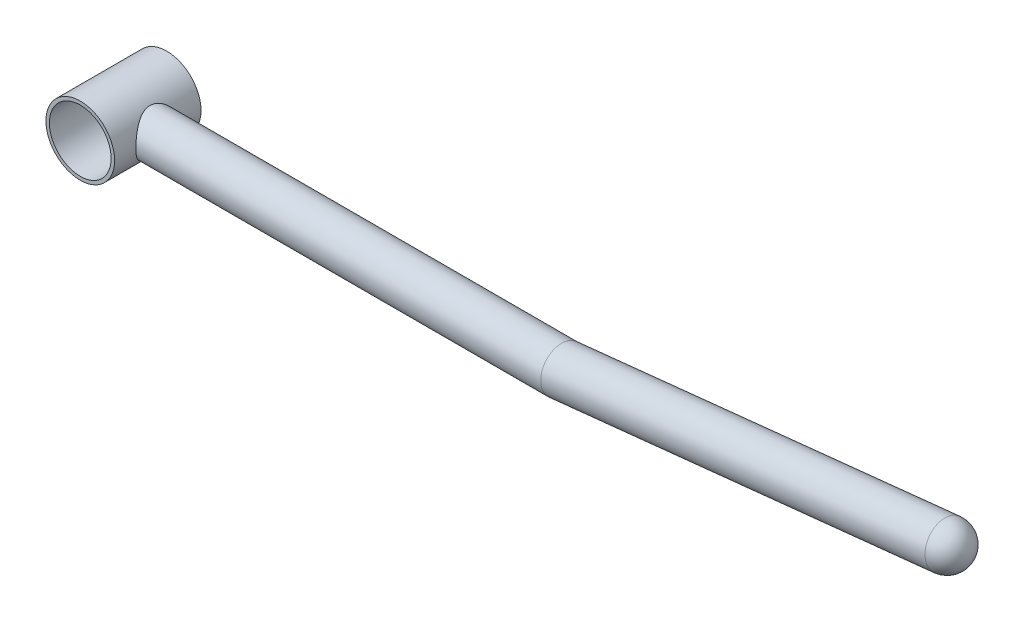
ISO-10303-21;
HEADER;
FILE_DESCRIPTION(('STEP AP214'),'2;1');
FILE_NAME('part.step','',(''),(''),'','','');
FILE_SCHEMA(('AUTOMOTIVE_DESIGN { 1 0 10303 214 1 1 1 1 }'));
ENDSEC;
DATA;
#1=APPLICATION_CONTEXT('core data for automotive mechanical design processes');
#2=APPLICATION_PROTOCOL_DEFINITION('international standard','automotive_design',2000,#1);
#3=PRODUCT_CONTEXT('',#1,'mechanical');
#4=PRODUCT('Part','Part','',(#3));
#5=PRODUCT_RELATED_PRODUCT_CATEGORY('part','',(#4));
#6=PRODUCT_DEFINITION_FORMATION('','',#4);
#7=PRODUCT_DEFINITION_CONTEXT('part definition',#1,'design');
#8=PRODUCT_DEFINITION('design','',#6,#7);
#9=PRODUCT_DEFINITION_SHAPE('','',#8);
#10=(LENGTH_UNIT() NAMED_UNIT(*) SI_UNIT(.MILLI.,.METRE.));
#11=(NAMED_UNIT(*) PLANE_ANGLE_UNIT() SI_UNIT($,.RADIAN.));
#12=(NAMED_UNIT(*) SI_UNIT($,.STERADIAN.) SOLID_ANGLE_UNIT());
#13=UNCERTAINTY_MEASURE_WITH_UNIT(LENGTH_MEASURE(1.E-05),#10,'distance_accuracy_value','');
#14=(GEOMETRIC_REPRESENTATION_CONTEXT(3) GLOBAL_UNCERTAINTY_ASSIGNED_CONTEXT((#13)) GLOBAL_UNIT_ASSIGNED_CONTEXT((#10,
#11,#12)) REPRESENTATION_CONTEXT('',''));
#15=CARTESIAN_POINT('',(0.,0.,0.));
#16=DIRECTION('',(0.,0.,1.));
#17=DIRECTION('',(1.,0.,0.));
#18=AXIS2_PLACEMENT_3D('',#15,#16,#17);
#19=CARTESIAN_POINT('',(0.,0.,-31.4999999999998));
#20=DIRECTION('',(0.,0.,1.));
#21=DIRECTION('',(1.,0.,0.));
#22=AXIS2_PLACEMENT_3D('',#19,#20,#21);
#23=CYLINDRICAL_SURFACE('',#22,22.5);
#24=CARTESIAN_POINT('',(0.,0.,-31.4999999999998));
#25=DIRECTION('',(0.,0.,1.));
#26=DIRECTION('',(1.,0.,0.));
#27=AXIS2_PLACEMENT_3D('',#24,#25,#26);
#28=CIRCLE('',#27,22.5);
#29=CARTESIAN_POINT('',(22.5,0.,-31.4999999999998));
#30=VERTEX_POINT('',#29);
#31=EDGE_CURVE('E72',#30,#30,#28,.T.);
#32=ORIENTED_EDGE('',*,*,#31,.F.);
#33=EDGE_LOOP('',(#32));
#34=FACE_BOUND('',#33,.T.);
#35=CARTESIAN_POINT('',(0.,1.11022302462516E-13,31.5));
#36=DIRECTION('',(0.,0.,1.));
#37=DIRECTION('',(1.,0.,0.));
#38=AXIS2_PLACEMENT_3D('',#35,#36,#37);
#39=CIRCLE('',#38,22.5);
#40=CARTESIAN_POINT('',(22.4999999999999,1.09773301559812E-13,31.5));
#41=VERTEX_POINT('',#40);
#42=EDGE_CURVE('E86',#41,#41,#39,.T.);
#43=ORIENTED_EDGE('',*,*,#42,.T.);
#44=EDGE_LOOP('',(#43));
#45=FACE_BOUND('',#44,.T.);
#46=ADVANCED_FACE('F67',(#34,#45),#23,.F.);
#47=CARTESIAN_POINT('',(0.,1.11022302462516E-13,31.5));
#48=DIRECTION('',(0.,0.,1.));
#49=DIRECTION('',(1.,0.,0.));
#50=AXIS2_PLACEMENT_3D('',#47,#48,#49);
#51=PLANE('',#50);
#52=CARTESIAN_POINT('',(0.,1.11022302462516E-13,31.5));
#53=DIRECTION('',(0.,0.,1.));
#54=DIRECTION('',(1.,0.,0.));
#55=AXIS2_PLACEMENT_3D('',#52,#53,#54);
#56=CIRCLE('',#55,25.);
#57=CARTESIAN_POINT('',(24.9999999999999,1.09634523681734E-13,31.5));
#58=VERTEX_POINT('',#57);
#59=EDGE_CURVE('E78',#58,#58,#56,.T.);
#60=ORIENTED_EDGE('',*,*,#59,.T.);
#61=EDGE_LOOP('',(#60));
#62=FACE_BOUND('',#61,.T.);
#63=ORIENTED_EDGE('',*,*,#42,.F.);
#64=EDGE_LOOP('',(#63));
#65=FACE_BOUND('',#64,.T.);
#66=ADVANCED_FACE('F94',(#62,#65),#51,.T.);
#67=CARTESIAN_POINT('',(0.,0.,-31.4999999999998));
#68=DIRECTION('',(0.,0.,1.));
#69=DIRECTION('',(1.,0.,0.));
#70=AXIS2_PLACEMENT_3D('',#67,#68,#69);
#71=PLANE('',#70);
#72=ORIENTED_EDGE('',*,*,#31,.T.);
#73=EDGE_LOOP('',(#72));
#74=FACE_BOUND('',#73,.T.);
#75=CARTESIAN_POINT('',(0.,0.,-31.4999999999998));
#76=DIRECTION('',(0.,0.,1.));
#77=DIRECTION('',(1.,0.,0.));
#78=AXIS2_PLACEMENT_3D('',#75,#76,#77);
#79=CIRCLE('',#78,25.);
#80=CARTESIAN_POINT('',(25.,0.,-31.4999999999998));
#81=VERTEX_POINT('',#80);
#82=EDGE_CURVE('E12',#81,#81,#79,.T.);
#83=ORIENTED_EDGE('',*,*,#82,.F.);
#84=EDGE_LOOP('',(#83));
#85=FACE_BOUND('',#84,.T.);
#86=ADVANCED_FACE('F97',(#74,#85),#71,.F.);
#87=CARTESIAN_POINT('',(0.,0.,-31.4999999999998));
#88=DIRECTION('',(0.,0.,1.));
#89=DIRECTION('',(1.,0.,0.));
#90=AXIS2_PLACEMENT_3D('',#87,#88,#89);
#91=CYLINDRICAL_SURFACE('',#90,25.);
#92=ORIENTED_EDGE('',*,*,#59,.F.);
#93=EDGE_LOOP('',(#92));
#94=FACE_BOUND('',#93,.T.);
#95=ORIENTED_EDGE('',*,*,#82,.T.);
#96=EDGE_LOOP('',(#95));
#97=FACE_BOUND('',#96,.T.);
#98=ADVANCED_FACE('F104',(#94,#97),#91,.T.);
#99=CLOSED_SHELL('',(#46,#66,#86,#98));
#100=MANIFOLD_SOLID_BREP('B2',#99);
#101=CARTESIAN_POINT('',(319.155222029483,-0.0887897425605882,0.));
#102=DIRECTION('',(0.994521895368273,0.104528463267654,0.));
#103=DIRECTION('',(-0.104528463267654,0.994521895368273,0.));
#104=AXIS2_PLACEMENT_3D('',#101,#102,#103);
#105=CYLINDRICAL_SURFACE('',#104,13.);
#106=CARTESIAN_POINT('',(320.,-2.63677968348475E-13,0.));
#107=DIRECTION('',(0.998629534754574,0.0523359562429442,0.));
#108=DIRECTION('',(0.0523359562429442,-0.998629534754574,0.));
#109=AXIS2_PLACEMENT_3D('',#106,#107,#108);
#110=ELLIPSE('',#109,13.017840497973,13.);
#111=CARTESIAN_POINT('',(320.68130113068,-13.0000000000003,0.));
#112=VERTEX_POINT('',#111);
#113=EDGE_CURVE('E66',#112,#112,#110,.T.);
#114=ORIENTED_EDGE('',*,*,#113,.F.);
#115=EDGE_LOOP('',(#114));
#116=FACE_BOUND('',#115,.T.);
#117=CARTESIAN_POINT('',(590.723717305304,28.4542092756554,0.));
#118=DIRECTION('',(0.994521895368279,0.104528463267654,0.));
#119=DIRECTION('',(-0.104528463267654,0.994521895368273,0.));
#120=AXIS2_PLACEMENT_3D('',#117,#118,#119);
#121=CIRCLE('',#120,13.);
#122=CARTESIAN_POINT('',(589.364847282825,41.382993915443,0.));
#123=VERTEX_POINT('',#122);
#124=EDGE_CURVE('E206',#123,#123,#121,.T.);
#125=ORIENTED_EDGE('',*,*,#124,.T.);
#126=EDGE_LOOP('',(#125));
#127=FACE_BOUND('',#126,.T.);
#128=ADVANCED_FACE('F146',(#116,#127),#105,.F.);
#129=CARTESIAN_POINT('',(0.,0.,-31.4999999999998));
#130=DIRECTION('',(0.,0.,1.));
#131=DIRECTION('',(1.,0.,0.));
#132=AXIS2_PLACEMENT_3D('',#129,#130,#131);
#133=CYLINDRICAL_SURFACE('',#132,25.);
#134=CARTESIAN_POINT('',(25.,0.,-16.));
#135=CARTESIAN_POINT('',(25.0000015619882,0.404925044071167,-16.0000018773157));
#136=CARTESIAN_POINT('',(24.9901420976649,0.80983241181595,-15.9846099706384));
#137=CARTESIAN_POINT('',(24.9509510419688,1.61652618236303,-15.9232696828799));
#138=CARTESIAN_POINT('',(24.9216122625561,2.01831137766449,-15.8773100220157));
#139=CARTESIAN_POINT('',(24.8441286420605,2.81604821037121,-15.7554098701401));
#140=CARTESIAN_POINT('',(24.7959565811092,3.21199053959232,-15.6794259832055));
#141=CARTESIAN_POINT('',(24.6819740036757,3.99456099671041,-15.4985408355825));
#142=CARTESIAN_POINT('',(24.6161648797958,4.38118985736241,-15.3936418579778));
#143=CARTESIAN_POINT('',(24.468785547579,5.14076609074129,-15.1568468243225));
#144=CARTESIAN_POINT('',(24.3872961899422,5.51377244407873,-15.0250890594708));
#145=CARTESIAN_POINT('',(24.2100855842812,6.24609510158301,-14.7357159583602));
#146=CARTESIAN_POINT('',(24.114364104839,6.60541118302308,-14.5781002016395));
#147=CARTESIAN_POINT('',(23.9106324755013,7.30859986653995,-14.2385667901491));
#148=CARTESIAN_POINT('',(23.8026253610818,7.65247625422333,-14.0566551363674));
#149=CARTESIAN_POINT('',(23.5763254629354,8.32360019852913,-13.6699562899149));
#150=CARTESIAN_POINT('',(23.4580313681203,8.65084562706955,-13.4651661804074));
#151=CARTESIAN_POINT('',(23.2032751229576,9.31365412183647,-13.0164828623735));
#152=CARTESIAN_POINT('',(23.0661182340287,9.64771274316308,-12.7707619235134));
#153=CARTESIAN_POINT('',(22.7850064089793,10.2940617258667,-12.2557366535805));
#154=CARTESIAN_POINT('',(22.6410511668713,10.6063511058609,-11.986431260526));
#155=CARTESIAN_POINT('',(22.3490022897849,11.2086687230747,-11.4252092234651));
#156=CARTESIAN_POINT('',(22.2009034973146,11.4986673651024,-11.1332635184821));
#157=CARTESIAN_POINT('',(21.9037344054836,12.0551203444099,-10.5282019106555));
#158=CARTESIAN_POINT('',(21.7546640715095,12.3215738378621,-10.2150852497816));
#159=CARTESIAN_POINT('',(21.4374499122155,12.8665793254927,-9.52219977657803));
#160=CARTESIAN_POINT('',(21.2696389657507,13.1413799496497,-9.13931438351674));
#161=CARTESIAN_POINT('',(20.9419379170097,13.6575524379487,-8.34831618545189));
#162=CARTESIAN_POINT('',(20.7820494133893,13.8989175727053,-7.94019832587853));
#163=CARTESIAN_POINT('',(20.4759821659352,14.3459904698912,-7.10058524689509));
#164=CARTESIAN_POINT('',(20.3297848843603,14.5517467761612,-6.66912292284887));
#165=CARTESIAN_POINT('',(20.125210028945,14.8320367864774,-6.0056905539049));
#166=CARTESIAN_POINT('',(20.0594794225191,14.9207331379767,-5.78186975362445));
#167=CARTESIAN_POINT('',(19.9336577942812,15.0884150598227,-5.32898189890048));
#168=CARTESIAN_POINT('',(19.8735682005867,15.1673981726601,-5.09991353410981));
#169=CARTESIAN_POINT('',(19.7336948385013,15.3492623867948,-4.53055229253505));
#170=CARTESIAN_POINT('',(19.6575477076492,15.4464497728832,-4.18751389202001));
#171=CARTESIAN_POINT('',(19.5213584735089,15.6182136002395,-3.49276536899678));
#172=CARTESIAN_POINT('',(19.4613122707707,15.6927957976357,-3.14105747877294));
#173=CARTESIAN_POINT('',(19.3594402998738,15.8183001813279,-2.43126972701562));
#174=CARTESIAN_POINT('',(19.3175916839815,15.8692520417559,-2.073198446639));
#175=CARTESIAN_POINT('',(19.2535956523238,15.9468367737908,-1.35265801288941));
#176=CARTESIAN_POINT('',(19.231448454688,15.9734693761404,-0.990188810868689));
#177=CARTESIAN_POINT('',(19.2077129340946,16.0020035959887,-0.262460156150201));
#178=CARTESIAN_POINT('',(19.2061890356968,16.0038277150334,0.102804475372643));
#179=CARTESIAN_POINT('',(19.2239297577433,15.9825126443981,0.832091460399967));
#180=CARTESIAN_POINT('',(19.24319448145,15.9593733307183,1.19611380772469));
#181=CARTESIAN_POINT('',(19.3017467127909,15.8885074198918,1.92037328223335));
#182=CARTESIAN_POINT('',(19.3410485617405,15.840763211842,2.28060750937677));
#183=CARTESIAN_POINT('',(19.4381624474469,15.7214419318028,2.99454239108497));
#184=CARTESIAN_POINT('',(19.4959748739967,15.6498643579324,3.34824290789787));
#185=CARTESIAN_POINT('',(19.6260739031016,15.4863735674022,4.0365255861004));
#186=CARTESIAN_POINT('',(19.6978709558273,15.3951393603922,4.37136256989095));
#187=CARTESIAN_POINT('',(19.8548252831695,15.1921818732877,5.03160397521657));
#188=CARTESIAN_POINT('',(19.9399877947337,15.0804505589621,5.35700463988363));
#189=CARTESIAN_POINT('',(20.2121658403418,14.7159808896164,6.31729900859798));
#190=CARTESIAN_POINT('',(20.415946958597,14.4338764142665,6.93665942019123));
#191=CARTESIAN_POINT('',(20.7627220180091,13.9270311591719,7.88670986628187));
#192=CARTESIAN_POINT('',(20.8971209302017,13.7249831568111,8.23315173665748));
#193=CARTESIAN_POINT('',(21.1722128751606,13.296696161189,8.90828480780058));
#194=CARTESIAN_POINT('',(21.3129064950319,13.0704549086853,9.23697434647801));
#195=CARTESIAN_POINT('',(21.5975435918727,12.5945655171764,9.87602455074293));
#196=CARTESIAN_POINT('',(21.7414903876451,12.3448925721122,10.186365211751));
#197=CARTESIAN_POINT('',(22.0295648350164,11.8231591635808,10.7875537186822));
#198=CARTESIAN_POINT('',(22.1736924970078,11.5510973496357,11.0784003868212));
#199=CARTESIAN_POINT('',(22.4854503237814,10.9336594778249,11.6908990129206));
#200=CARTESIAN_POINT('',(22.6525676241315,10.5839664649271,12.0084814733921));
#201=CARTESIAN_POINT('',(22.9788334546105,9.85558430354014,12.6131505683739));
#202=CARTESIAN_POINT('',(23.1379806516689,9.47689033099563,12.9002321102806));
#203=CARTESIAN_POINT('',(23.4439951491246,8.6923014745234,13.441378879551));
#204=CARTESIAN_POINT('',(23.5908728474814,8.28643015897201,13.6954721665991));
#205=CARTESIAN_POINT('',(23.7989867549893,7.65877791158838,14.0499422909589));
#206=CARTESIAN_POINT('',(23.8663204968941,7.44643333273023,14.1636478233455));
#207=CARTESIAN_POINT('',(23.9964832307619,7.01565570471911,14.3818943973732));
#208=CARTESIAN_POINT('',(24.0593110591769,6.79722110303667,14.4864330734262));
#209=CARTESIAN_POINT('',(24.2163596379815,6.22117702909598,14.7461292462035));
#210=CARTESIAN_POINT('',(24.3066645830134,5.85907262264254,14.8937970331853));
#211=CARTESIAN_POINT('',(24.472571043401,5.12210088957016,15.1630462524395));
#212=CARTESIAN_POINT('',(24.5481752064179,4.74723587549781,15.2846323825156));
#213=CARTESIAN_POINT('',(24.6830408717459,3.98702789616476,15.5003093339703));
#214=CARTESIAN_POINT('',(24.7423124565402,3.60169155725472,15.5944171205239));
#215=CARTESIAN_POINT('',(24.8432233011495,2.82284294906272,15.7540335011103));
#216=CARTESIAN_POINT('',(24.8848622338729,2.42933052825372,15.8195415646094));
#217=CARTESIAN_POINT('',(24.9496239299749,1.63564062619806,15.9212210484698));
#218=CARTESIAN_POINT('',(24.9726833167173,1.23544504541874,15.9572920615261));
#219=CARTESIAN_POINT('',(24.999477761314,0.432822676299672,15.9991921444796));
#220=CARTESIAN_POINT('',(25.003212815007,0.0303958874794856,16.0050212078648));
#221=CARTESIAN_POINT('',(24.9912650807508,-0.77348399629913,15.9863498172394));
#222=CARTESIAN_POINT('',(24.9755811323801,-1.17493703163256,15.9618475507193));
#223=CARTESIAN_POINT('',(24.9251836971058,-1.97366097901502,15.8828746268658));
#224=CARTESIAN_POINT('',(24.8904707030591,-2.37093199910768,15.8284047457009));
#225=CARTESIAN_POINT('',(24.8052000041333,-3.13731209509085,15.6939634497687));
#226=CARTESIAN_POINT('',(24.7555850388602,-3.50679388900706,15.6155053701042));
#227=CARTESIAN_POINT('',(24.6411050211605,-4.23704308721472,15.4333752681048));
#228=CARTESIAN_POINT('',(24.576240633445,-4.59781087058784,15.3297043447725));
#229=CARTESIAN_POINT('',(24.4325489543541,-5.30867908099245,15.0982672743781));
#230=CARTESIAN_POINT('',(24.3537207449647,-5.65877880490628,14.9704995431002));
#231=CARTESIAN_POINT('',(24.1835862363121,-6.34662960165215,14.692106023409));
#232=CARTESIAN_POINT('',(24.0922792512751,-6.68437999452999,14.5414789787067));
#233=CARTESIAN_POINT('',(23.8916275742826,-7.37070229752064,14.2066584791487));
#234=CARTESIAN_POINT('',(23.7814473707269,-7.71821923165104,14.0208041517281));
#235=CARTESIAN_POINT('',(23.5506783083946,-8.39605638651536,13.6257168103069));
#236=CARTESIAN_POINT('',(23.4300890414971,-8.72637593215553,13.4164828795389));
#237=CARTESIAN_POINT('',(23.180630204464,-9.36895085200474,12.9759241468039));
#238=CARTESIAN_POINT('',(23.0517555610962,-9.68119493171711,12.7445857670567));
#239=CARTESIAN_POINT('',(22.7880601838735,-10.2865613887257,12.2611877169459));
#240=CARTESIAN_POINT('',(22.6532388486398,-10.579681824615,12.0091259486241));
#241=CARTESIAN_POINT('',(22.3591293702995,-11.1893099340712,11.4453931745428));
#242=CARTESIAN_POINT('',(22.1992483653671,-11.5025558397825,11.1304967694322));
#243=CARTESIAN_POINT('',(21.8784405932856,-12.1016246389837,10.4760453865055));
#244=CARTESIAN_POINT('',(21.7175136803215,-12.3874436172205,10.1364869002433));
#245=CARTESIAN_POINT('',(21.3985808420018,-12.9305814468634,9.43383774878561));
#246=CARTESIAN_POINT('',(21.2405756556402,-13.1878931678843,9.07074123197174));
#247=CARTESIAN_POINT('',(20.9318561584343,-13.6725981697188,8.32218851305903));
#248=CARTESIAN_POINT('',(20.7811407458473,-13.8999959805734,7.93673570927368));
#249=CARTESIAN_POINT('',(20.511424857198,-14.294422572615,7.19860411557446));
#250=CARTESIAN_POINT('',(20.3909016210024,-14.4654551193313,6.84861937048306));
#251=CARTESIAN_POINT('',(20.1620574047654,-14.7827501975162,6.13377200246871));
#252=CARTESIAN_POINT('',(20.0537340572626,-14.9290175376039,5.76891228490505));
#253=CARTESIAN_POINT('',(19.8527690015487,-15.1952420148147,5.02594698508988));
#254=CARTESIAN_POINT('',(19.7601104179273,-15.315227506719,4.64785619353897));
#255=CARTESIAN_POINT('',(19.5936975313565,-15.5275641940392,3.87987504664825));
#256=CARTESIAN_POINT('',(19.5199429946438,-15.6199157311731,3.48998483728422));
#257=CARTESIAN_POINT('',(19.3938056687495,-15.7762650376,2.69708614747012));
#258=CARTESIAN_POINT('',(19.3416363723446,-15.8399800811272,2.29398728836183));
#259=CARTESIAN_POINT('',(19.2621898317534,-15.9364986807434,1.48164477784622));
#260=CARTESIAN_POINT('',(19.2349119436678,-15.9693030364411,1.07240128566869));
#261=CARTESIAN_POINT('',(19.2066524645509,-16.0032809353728,0.25193788201469));
#262=CARTESIAN_POINT('',(19.2056547442586,-16.004473879882,-0.159280662259538));
#263=CARTESIAN_POINT('',(19.2299728056356,-15.9752468012828,-0.979782619212495));
#264=CARTESIAN_POINT('',(19.2552864904598,-15.9448292973183,-1.38906618348534));
#265=CARTESIAN_POINT('',(19.3254345723058,-15.8596997261339,-2.14298597707886));
#266=CARTESIAN_POINT('',(19.3669198547315,-15.8091331210736,-2.48841817165336));
#267=CARTESIAN_POINT('',(19.4667172401765,-15.6860828655746,-3.17297476292434));
#268=CARTESIAN_POINT('',(19.5250341268026,-15.6135929841754,-3.51209733719583));
#269=CARTESIAN_POINT('',(19.6566579347328,-15.4475564981702,-4.18238074207549));
#270=CARTESIAN_POINT('',(19.7299743789902,-15.3539965127064,-4.51353636459296));
#271=CARTESIAN_POINT('',(19.8894647238651,-15.1468238889593,-5.16633733479823));
#272=CARTESIAN_POINT('',(19.9756403612109,-15.0332085416725,-5.4879813908378));
#273=CARTESIAN_POINT('',(20.1902486625657,-14.7443693949179,-6.22993479625902));
#274=CARTESIAN_POINT('',(20.3230031980175,-14.5614134998206,-6.64600179716882));
#275=CARTESIAN_POINT('',(20.6025569184014,-14.1631148541739,-7.45724147650282));
#276=CARTESIAN_POINT('',(20.749355758879,-13.9477728978598,-7.85241466700537));
#277=CARTESIAN_POINT('',(21.0523136209135,-13.4861556789327,-8.62118734138403));
#278=CARTESIAN_POINT('',(21.2084841630587,-13.2398419180562,-8.99475911587238));
#279=CARTESIAN_POINT('',(21.5254932104696,-12.7179541719608,-9.71868049711525));
#280=CARTESIAN_POINT('',(21.6863313712945,-12.4423823418331,-10.0690318111594));
#281=CARTESIAN_POINT('',(22.010442238798,-11.8597161505609,-10.7494224070123));
#282=CARTESIAN_POINT('',(22.1737212606611,-11.5522878757904,-11.0791728601147));
#283=CARTESIAN_POINT('',(22.4968024507647,-10.9097759508099,-11.7123977011905));
#284=CARTESIAN_POINT('',(22.6566045458943,-10.5746917197738,-12.015871537032));
#285=CARTESIAN_POINT('',(22.9689581645052,-9.87788824812164,-12.5949385398337));
#286=CARTESIAN_POINT('',(23.1215088222784,-9.51616584039971,-12.8705283822916));
#287=CARTESIAN_POINT('',(23.3420621846537,-8.95480859407576,-13.261349891443));
#288=CARTESIAN_POINT('',(23.4142021245946,-8.76455786261016,-13.3878647497721));
#289=CARTESIAN_POINT('',(23.5553237080331,-8.3778936268431,-13.633170703046));
#290=CARTESIAN_POINT('',(23.6243041595969,-8.18147784307574,-13.751958890048));
#291=CARTESIAN_POINT('',(23.8300744697518,-7.57072389698194,-14.103523717243));
#292=CARTESIAN_POINT('',(23.9609814020929,-7.14672497942363,-14.3232105083789));
#293=CARTESIAN_POINT('',(24.2035792788676,-6.27620668494695,-14.7254539287128));
#294=CARTESIAN_POINT('',(24.3152735453921,-5.82969121870051,-14.9080169780294));
#295=CARTESIAN_POINT('',(24.4657106327018,-5.14619804504758,-15.1517335983942));
#296=CARTESIAN_POINT('',(24.5129636821995,-4.91633650685727,-15.227884958496));
#297=CARTESIAN_POINT('',(24.6014604241758,-4.45240645515498,-15.3699361290149));
#298=CARTESIAN_POINT('',(24.6427057539856,-4.21833910749479,-15.4358387329389));
#299=CARTESIAN_POINT('',(24.756860888756,-3.51078593222705,-15.6176557338746));
#300=CARTESIAN_POINT('',(24.8202802251292,-3.031542391595,-15.7178247777837));
#301=CARTESIAN_POINT('',(24.912855714342,-2.12784973800438,-15.8635762871442));
#302=CARTESIAN_POINT('',(24.9454536896083,-1.70461817648611,-15.9146575501141));
#303=CARTESIAN_POINT('',(24.989025253133,-0.854251246410972,-15.9828688003041));
#304=CARTESIAN_POINT('',(24.9999983524116,-0.427115789798958,-15.9999980198035));
#305=CARTESIAN_POINT('',(25.,0.,-16.));
#306=B_SPLINE_CURVE_WITH_KNOTS('',3,(#134,#135,#136,#137,#138,#139,#140,#141,#142,#143,#144,
#145,#146,#147,#148,#149,#150,#151,#152,#153,#154,#155,#156,#157,#158,#159,#160,#161,#162,#163,
#164,#165,#166,#167,#168,#169,#170,#171,#172,#173,#174,#175,#176,#177,#178,#179,#180,#181,#182,
#183,#184,#185,#186,#187,#188,#189,#190,#191,#192,#193,#194,#195,#196,#197,#198,#199,#200,#201,
#202,#203,#204,#205,#206,#207,#208,#209,#210,#211,#212,#213,#214,#215,#216,#217,#218,#219,#220,
#221,#222,#223,#224,#225,#226,#227,#228,#229,#230,#231,#232,#233,#234,#235,#236,#237,#238,#239,
#240,#241,#242,#243,#244,#245,#246,#247,#248,#249,#250,#251,#252,#253,#254,#255,#256,#257,#258,
#259,#260,#261,#262,#263,#264,#265,#266,#267,#268,#269,#270,#271,#272,#273,#274,#275,#276,#277,
#278,#279,#280,#281,#282,#283,#284,#285,#286,#287,#288,#289,#290,#291,#292,#293,#294,#295,#296,
#297,#298,#299,#300,#301,#302,#303,#304,#305),.UNSPECIFIED.,.T.,.F.,(4,2,2,2,2,2,2,2,2,2,2,2,2,
2,2,2,2,2,2,2,2,2,2,2,2,2,2,2,2,2,2,2,2,2,2,2,2,2,2,2,2,2,2,2,2,2,2,2,2,2,2,2,2,2,2,2,2,2,2,2,2,
2,2,2,2,2,2,2,2,2,2,2,2,2,2,2,2,2,2,2,2,2,2,2,2,4),(0.,1.21433590372914,2.42912015739391,
3.64566667645117,4.86211716668053,6.07245576879083,7.28281405347479,8.49287393554717,
9.70308826789623,11.0121682302354,12.3213071693168,13.6321552474754,14.94305028569,
16.4420715483407,17.9413940741467,19.4386562617973,20.1870950354634,20.9357227808742,
22.028319245148,23.1206372592164,24.2115798402965,25.3025344998959,26.3968963790286,
27.4912636941616,28.5864153906041,29.6815901501148,30.743708769795,31.8062446000703,
33.9301496941282,35.1981954835547,36.4663597906899,37.7358821242909,39.0054810906219,
40.5068568446589,42.0084828841261,43.5088231589309,44.2589005189371,45.0091708768569,
46.211870717727,47.41435374719,48.6160927841587,49.8178541128161,51.0236976145029,
52.2295413758453,53.4354571982781,54.6413417886698,55.7829773658004,56.9245631890966,
58.0662240907685,59.2079477579221,60.434340837466,61.6607820235585,62.8879814611389,
64.1153052891326,65.5300085169599,66.9449133972261,68.3601713857367,69.7752148060012,
70.9973815410782,72.2193106972439,73.4399149816461,74.6605041715844,75.8928927793551,
77.1252495063836,78.3568498658444,79.5883520824209,80.6419106900126,81.6957690183668,
82.7502985106614,83.804970554018,85.2234889733914,86.6419726107121,88.0622371979516,
89.4823972438029,90.9193332530906,92.3562994483687,93.7934367662636,94.5120249362064,
95.2308820013993,96.7140532599454,98.1969678027554,98.9368252382388,99.6764806557274,
101.154474230587,102.435329338598,103.716213408864),.UNSPECIFIED.);
#307=CARTESIAN_POINT('',(25.,0.,-16.));
#308=VERTEX_POINT('',#307);
#309=EDGE_CURVE('E169',#308,#308,#306,.T.);
#310=ORIENTED_EDGE('',*,*,#309,.F.);
#311=EDGE_LOOP('',(#310));
#312=FACE_BOUND('',#311,.T.);
#313=CARTESIAN_POINT('',(25.,0.,-13.));
#314=CARTESIAN_POINT('',(25.0000001702951,0.340204341556711,-13.0000002605469));
#315=CARTESIAN_POINT('',(24.9930404339722,0.680407398946605,-12.9866312335491));
#316=CARTESIAN_POINT('',(24.9653795457232,1.35828658290201,-12.9333172013216));
#317=CARTESIAN_POINT('',(24.9446731560876,1.69596169666535,-12.8933620663176));
#318=CARTESIAN_POINT('',(24.8900097902791,2.36659610841475,-12.787284817259));
#319=CARTESIAN_POINT('',(24.8560330742241,2.69954761172964,-12.7211237192156));
#320=CARTESIAN_POINT('',(24.7756947044239,3.35781135937109,-12.5634249675724));
#321=CARTESIAN_POINT('',(24.7293341095554,3.68312425424668,-12.4718894835703));
#322=CARTESIAN_POINT('',(24.6255688554871,4.32272079072738,-12.2648533671194));
#323=CARTESIAN_POINT('',(24.5682093410991,4.63704351161461,-12.1494505505013));
#324=CARTESIAN_POINT('',(24.4436597947736,5.25419927223121,-11.8955762989635));
#325=CARTESIAN_POINT('',(24.3764695871903,5.55703210654807,-11.7571044518615));
#326=CARTESIAN_POINT('',(24.233778217634,6.14953905610842,-11.4583255812006));
#327=CARTESIAN_POINT('',(24.1582797305099,6.43921736426604,-11.2980255812883));
#328=CARTESIAN_POINT('',(24.000540363323,7.004295837121,-10.9566807261631));
#329=CARTESIAN_POINT('',(23.9182968241314,7.27969030011881,-10.7756276780999));
#330=CARTESIAN_POINT('',(23.7434002492631,7.83199229786596,-10.3818175128945));
#331=CARTESIAN_POINT('',(23.6504178454092,8.10787978953947,-10.1677757714219));
#332=CARTESIAN_POINT('',(23.4609295387331,8.64087979600825,-9.71887936079717));
#333=CARTESIAN_POINT('',(23.3644234157452,8.89799113462833,-9.48402338983717));
#334=CARTESIAN_POINT('',(23.1700602079765,9.39249366090135,-8.99456329897688));
#335=CARTESIAN_POINT('',(23.0722022491853,9.62987132027756,-8.73994585923686));
#336=CARTESIAN_POINT('',(22.8775106421766,10.0836744087496,-8.21222552962033));
#337=CARTESIAN_POINT('',(22.7806771966092,10.3000957592059,-7.93911905880445));
#338=CARTESIAN_POINT('',(22.5822888490217,10.7284964327014,-7.3513749145009));
#339=CARTESIAN_POINT('',(22.481043246562,10.93849600624,-7.03518507315822));
#340=CARTESIAN_POINT('',(22.2858801591023,11.3308229951788,-6.38410817370154));
#341=CARTESIAN_POINT('',(22.1919595696191,11.5131621649044,-6.0492291408084));
#342=CARTESIAN_POINT('',(22.0146986809145,11.8485879046015,-5.36254695746018));
#343=CARTESIAN_POINT('',(21.9313549724186,12.0016839086796,-5.01074931110379));
#344=CARTESIAN_POINT('',(21.7784580170517,12.2769537883593,-4.29235509486122));
#345=CARTESIAN_POINT('',(21.7089031203845,12.3991313637562,-3.92576030174078));
#346=CARTESIAN_POINT('',(21.5903500865379,12.6043629187561,-3.20346421783486));
#347=CARTESIAN_POINT('',(21.5403502422914,12.6893619783101,-2.84848107070361));
#348=CARTESIAN_POINT('',(21.4572325913045,12.8294128842362,-2.13068849042776));
#349=CARTESIAN_POINT('',(21.4241140048536,12.8844661137523,-1.76787941955335));
#350=CARTESIAN_POINT('',(21.376274260435,12.9636820658165,-1.03804927127552));
#351=CARTESIAN_POINT('',(21.3615350976161,12.9878750202419,-0.671032672008144));
#352=CARTESIAN_POINT('',(21.3510919525863,13.005037294253,0.0639829049794007));
#353=CARTESIAN_POINT('',(21.3553858749056,12.9980100510628,0.431981770097693));
#354=CARTESIAN_POINT('',(21.3809744361808,12.9558632471136,1.11682419553349));
#355=CARTESIAN_POINT('',(21.3999471184325,12.9245793432344,1.43400051085885));
#356=CARTESIAN_POINT('',(21.4513850657515,12.8390254131686,2.06409467935665));
#357=CARTESIAN_POINT('',(21.4838489251264,12.7847577817246,2.37701297268016));
#358=CARTESIAN_POINT('',(21.5612000109803,12.6538695805647,2.99664852968677));
#359=CARTESIAN_POINT('',(21.6060908900214,12.57724243856,3.3033639417278));
#360=CARTESIAN_POINT('',(21.7068912451887,12.4024608935272,3.90873848700594));
#361=CARTESIAN_POINT('',(21.762801348235,12.3043052656364,4.20739716076889));
#362=CARTESIAN_POINT('',(21.8854021362746,12.0849206332376,4.80180428937914));
#363=CARTESIAN_POINT('',(21.9523083659045,11.963219265303,5.09733351426712));
#364=CARTESIAN_POINT('',(22.0941388090985,11.6992085742154,5.67715063863966));
#365=CARTESIAN_POINT('',(22.1690658722146,11.5568919207108,5.961434493544));
#366=CARTESIAN_POINT('',(22.3250447451084,11.2526262769884,6.51758307972461));
#367=CARTESIAN_POINT('',(22.4060974611471,11.0906743796803,6.78944596379384));
#368=CARTESIAN_POINT('',(22.5724495904421,10.7480596754283,7.31976006889727));
#369=CARTESIAN_POINT('',(22.6577493696674,10.5673952545739,7.5782101302172));
#370=CARTESIAN_POINT('',(22.8427910876144,10.1618510404295,8.11574601244614));
#371=CARTESIAN_POINT('',(22.9428928684982,9.9343156304248,8.39270922645565));
#372=CARTESIAN_POINT('',(23.1435765880186,9.45736642762519,8.92672110387905));
#373=CARTESIAN_POINT('',(23.2441583542523,9.20796000234902,9.18377641898082));
#374=CARTESIAN_POINT('',(23.4434247189345,8.68811741227002,9.67704045788515));
#375=CARTESIAN_POINT('',(23.5421074282717,8.41766153341634,9.91322918602657));
#376=CARTESIAN_POINT('',(23.7350166282809,7.85727444054346,10.3630243896246));
#377=CARTESIAN_POINT('',(23.8292448700257,7.56735098964694,10.5766397802582));
#378=CARTESIAN_POINT('',(24.0159165363006,6.95300766906355,10.9909184267305));
#379=CARTESIAN_POINT('',(24.107984050306,6.62756919158459,11.190245038326));
#380=CARTESIAN_POINT('',(24.2820551849577,5.95829998015002,11.5604889540315));
#381=CARTESIAN_POINT('',(24.3640582711835,5.61446827090574,11.7314047496998));
#382=CARTESIAN_POINT('',(24.5155496358199,4.91092630347299,12.0428685124478));
#383=CARTESIAN_POINT('',(24.5850464379466,4.55122706965024,12.1834371759037));
#384=CARTESIAN_POINT('',(24.7094575033801,3.81847311593513,12.4325762872161));
#385=CARTESIAN_POINT('',(24.7643735989231,3.44542008079609,12.5411507557055));
#386=CARTESIAN_POINT('',(24.8537932635498,2.72212497978357,12.7167694571395));
#387=CARTESIAN_POINT('',(24.8896586556958,2.37272818848616,12.7866083425203));
#388=CARTESIAN_POINT('',(24.9467822310975,1.66820731481843,12.8974497531461));
#389=CARTESIAN_POINT('',(24.9680412454699,1.31308355949483,12.938453919117));
#390=CARTESIAN_POINT('',(24.9953372145888,0.600241534169999,12.9910502626931));
#391=CARTESIAN_POINT('',(25.0013810001355,0.242524500772217,13.0026556387513));
#392=CARTESIAN_POINT('',(24.9980897956797,-0.472568281323107,12.9963266463505));
#393=CARTESIAN_POINT('',(24.9887555999268,-0.829944046692765,12.9783938034962));
#394=CARTESIAN_POINT('',(24.9564294026083,-1.51086986057757,12.9160363818734));
#395=CARTESIAN_POINT('',(24.9346722094452,-1.83470159127865,12.8740056742875));
#396=CARTESIAN_POINT('',(24.8790511939545,-2.47725396176564,12.765944390214));
#397=CARTESIAN_POINT('',(24.8451882289765,-2.79597496183172,12.6999155133087));
#398=CARTESIAN_POINT('',(24.766139501782,-3.42625621540587,12.5445658477688));
#399=CARTESIAN_POINT('',(24.7209531438575,-3.73781609123534,12.4552438337044));
#400=CARTESIAN_POINT('',(24.620271024918,-4.35190563007049,12.2541957081571));
#401=CARTESIAN_POINT('',(24.5647748219534,-4.65443490531803,12.1424686362255));
#402=CARTESIAN_POINT('',(24.4430747160215,-5.25670774338671,11.8943640239742));
#403=CARTESIAN_POINT('',(24.3766257963241,-5.55616446405649,11.7574111401168));
#404=CARTESIAN_POINT('',(24.2355715175429,-6.14230861229019,11.4621006480814));
#405=CARTESIAN_POINT('',(24.160966102937,-6.4289959529129,11.3037428941966));
#406=CARTESIAN_POINT('',(24.0051505936541,-6.98835111717408,10.9667487395544));
#407=CARTESIAN_POINT('',(23.9239396018854,-7.2610170283518,10.7881095831067));
#408=CARTESIAN_POINT('',(23.7565432995597,-7.79127682702302,10.4116180028175));
#409=CARTESIAN_POINT('',(23.6703560606782,-8.04886479279928,10.2137581102827));
#410=CARTESIAN_POINT('',(23.4856292873879,-8.57382447843011,9.77842372644101));
#411=CARTESIAN_POINT('',(23.3867367033098,-8.83943245109525,9.53896920244082));
#412=CARTESIAN_POINT('',(23.1874314036333,-9.34976393439384,9.03932821288081));
#413=CARTESIAN_POINT('',(23.0870186072029,-9.59448632988319,8.77914064175338));
#414=CARTESIAN_POINT('',(22.887110516247,-10.0620507857231,8.23910100305788));
#415=CARTESIAN_POINT('',(22.7876159414732,-10.2848768169049,7.95923478314317));
#416=CARTESIAN_POINT('',(22.5922160982303,-10.7072846739722,7.38120706012153));
#417=CARTESIAN_POINT('',(22.4963114881582,-10.9068622501451,7.08304222727233));
#418=CARTESIAN_POINT('',(22.3052612916402,-11.2926700415265,6.451403681382));
#419=CARTESIAN_POINT('',(22.2105044123059,-11.4773872953772,6.11688475724451));
#420=CARTESIAN_POINT('',(22.0314241505524,-11.8174996336923,5.43076621664594));
#421=CARTESIAN_POINT('',(21.9470956849842,-11.9729090233136,5.07917503907698));
#422=CARTESIAN_POINT('',(21.7921499120258,-12.2526641292616,4.36124897558969));
#423=CARTESIAN_POINT('',(21.7215207642575,-12.377036697733,3.99492715508193));
#424=CARTESIAN_POINT('',(21.5969433215622,-12.5931589215534,3.2500249330521));
#425=CARTESIAN_POINT('',(21.5429922017512,-12.6849141019516,2.8714466195187));
#426=CARTESIAN_POINT('',(21.458656255754,-12.8270106514004,2.14284735768966));
#427=CARTESIAN_POINT('',(21.4264839078581,-12.8805224532802,1.79365025233969));
#428=CARTESIAN_POINT('',(21.3791314413021,-12.9589685363216,1.09091304279895));
#429=CARTESIAN_POINT('',(21.3639501228918,-12.9839048352254,0.737373247031449));
#430=CARTESIAN_POINT('',(21.3512436401535,-13.0047892794407,0.0292937173012712));
#431=CARTESIAN_POINT('',(21.353709943799,-13.0007514327662,-0.325245450632859));
#432=CARTESIAN_POINT('',(21.3761714806744,-12.9637865667989,-1.03223989775355));
#433=CARTESIAN_POINT('',(21.3961657539679,-12.9308611295631,-1.38469528999593));
#434=CARTESIAN_POINT('',(21.4496636217354,-12.8418949370052,-2.04554774962028));
#435=CARTESIAN_POINT('',(21.4814218176075,-12.7888248333194,-2.35449361268803));
#436=CARTESIAN_POINT('',(21.5570744817719,-12.660887077032,-2.96642394793656));
#437=CARTESIAN_POINT('',(21.6009729128323,-12.5860123066123,-3.26940643892665));
#438=CARTESIAN_POINT('',(21.6995564155728,-12.4152708585043,-3.86752848418082));
#439=CARTESIAN_POINT('',(21.7542399509385,-12.319407170427,-4.16266914870906));
#440=CARTESIAN_POINT('',(21.872881341172,-12.1075101087352,-4.74382916806462));
#441=CARTESIAN_POINT('',(21.9368433471054,-11.9914677027854,-5.02984437003912));
#442=CARTESIAN_POINT('',(22.0768297233598,-11.7318682722637,-5.60988023012101));
#443=CARTESIAN_POINT('',(22.1533706935299,-11.5870037827014,-5.9031906950445));
#444=CARTESIAN_POINT('',(22.3130439293902,-11.276459878479,-6.47671356216441));
#445=CARTESIAN_POINT('',(22.3961768302114,-11.1107784572108,-6.75692469809876));
#446=CARTESIAN_POINT('',(22.5670204078958,-10.759541479419,-7.30327110023347));
#447=CARTESIAN_POINT('',(22.6547326813814,-10.5739789672017,-7.56940139107592));
#448=CARTESIAN_POINT('',(22.8327264881963,-10.1839365904836,-8.08655407978595));
#449=CARTESIAN_POINT('',(22.9230084116758,-9.97945384259798,-8.3375741652524));
#450=CARTESIAN_POINT('',(23.1164830455052,-9.52352561271488,-8.85648613197335));
#451=CARTESIAN_POINT('',(23.2197680225349,-9.2694707029496,-9.12205735890849));
#452=CARTESIAN_POINT('',(23.4243933460745,-8.73947735701821,-9.63101678327209));
#453=CARTESIAN_POINT('',(23.5257342602795,-8.46354543390263,-9.87441153687136));
#454=CARTESIAN_POINT('',(23.7239792256242,-7.89079880663998,-10.3378477265477));
#455=CARTESIAN_POINT('',(23.8208795085085,-7.59396688960524,-10.5578695299555));
#456=CARTESIAN_POINT('',(24.0076380669776,-6.98111137888984,-10.972738763088));
#457=CARTESIAN_POINT('',(24.0974966782235,-6.66508870126707,-11.1675873930506));
#458=CARTESIAN_POINT('',(24.2692315944732,-6.01006918147809,-11.5335229619459));
#459=CARTESIAN_POINT('',(24.3509477398867,-5.67077478852967,-11.7041537955039));
#460=CARTESIAN_POINT('',(24.502318285767,-4.97621533174344,-12.0159136870255));
#461=CARTESIAN_POINT('',(24.5719710042035,-4.62094804945507,-12.1570386314851));
#462=CARTESIAN_POINT('',(24.6969643435948,-3.89797268937784,-12.4077326955313));
#463=CARTESIAN_POINT('',(24.7523391963354,-3.53029680338428,-12.5173773635036));
#464=CARTESIAN_POINT('',(24.8472364755222,-2.78493029451911,-12.7040006084788));
#465=CARTESIAN_POINT('',(24.8867680603097,-2.40724559234935,-12.7809980589912));
#466=CARTESIAN_POINT('',(24.9449332055133,-1.69199000088579,-12.8938631665669));
#467=CARTESIAN_POINT('',(24.9655366753397,-1.35518744065156,-12.9336199803947));
#468=CARTESIAN_POINT('',(24.9930701432862,-0.678922867675696,-12.9866885681841));
#469=CARTESIAN_POINT('',(24.9999998300771,-0.339460794558034,-12.9999997400226));
#470=CARTESIAN_POINT('',(25.,0.,-13.));
#471=B_SPLINE_CURVE_WITH_KNOTS('',3,(#313,#314,#315,#316,#317,#318,#319,#320,#321,#322,#323,
#324,#325,#326,#327,#328,#329,#330,#331,#332,#333,#334,#335,#336,#337,#338,#339,#340,#341,#342,
#343,#344,#345,#346,#347,#348,#349,#350,#351,#352,#353,#354,#355,#356,#357,#358,#359,#360,#361,
#362,#363,#364,#365,#366,#367,#368,#369,#370,#371,#372,#373,#374,#375,#376,#377,#378,#379,#380,
#381,#382,#383,#384,#385,#386,#387,#388,#389,#390,#391,#392,#393,#394,#395,#396,#397,#398,#399,
#400,#401,#402,#403,#404,#405,#406,#407,#408,#409,#410,#411,#412,#413,#414,#415,#416,#417,#418,
#419,#420,#421,#422,#423,#424,#425,#426,#427,#428,#429,#430,#431,#432,#433,#434,#435,#436,#437,
#438,#439,#440,#441,#442,#443,#444,#445,#446,#447,#448,#449,#450,#451,#452,#453,#454,#455,#456,
#457,#458,#459,#460,#461,#462,#463,#464,#465,#466,#467,#468,#469,#470),.UNSPECIFIED.,.T.,.F.,(4,
2,2,2,2,2,2,2,2,2,2,2,2,2,2,2,2,2,2,2,2,2,2,2,2,2,2,2,2,2,2,2,2,2,2,2,2,2,2,2,2,2,2,2,2,2,2,2,2,
2,2,2,2,2,2,2,2,2,2,2,2,2,2,2,2,2,2,2,2,2,2,2,2,2,2,2,2,2,4),(0.,1.0202795562173,
2.04094807964385,3.06314068652993,4.08524591935991,5.10324242636788,6.12125712422276,
7.13894502604921,8.15703608159852,9.23994800268292,10.3229277014169,11.4066438093923,
12.49057041438,13.6676387916422,14.8442055624167,16.0203921187717,17.1964378623612,
18.3001038275571,19.4037188120811,20.5062518217764,21.608663449819,22.5653716520828,
23.5219801965971,24.4788702075451,25.4358146748616,26.4144394568525,27.3934130748458,
28.3725318118935,29.3517350660207,30.4669990689224,31.5818888141923,32.6978355834276,
33.8133399572273,34.9895241711448,36.165770813371,37.3412127176669,38.5165068439745,
39.5893777890353,40.6621876816652,41.7345158557517,42.8067886474354,43.787464314856,
44.7680705430484,45.7487283704163,46.7294282451157,47.7361463333859,48.7428712749188,
49.7497331670254,50.7569878772619,51.8688862899067,52.9808440330754,54.0936098105843,
55.206578678513,56.3861357291673,57.5651155398434,58.7430717676458,59.9208283666209,
60.9835114624635,62.0461195166645,63.1082138706397,64.1702500616155,65.1144289640876,
66.0589164262578,67.003269445313,67.9480462659941,68.9549450451934,69.9619409570316,
70.9692903389221,71.9767934913615,73.1207737480393,74.2644146977331,75.4090088041608,
76.55354831705,77.7173883760497,78.8813905814239,80.0425755329627,81.2030882797358,
82.221114745277,83.2391643893229),.UNSPECIFIED.);
#472=CARTESIAN_POINT('',(25.,0.,-13.));
#473=VERTEX_POINT('',#472);
#474=EDGE_CURVE('E153',#473,#473,#471,.T.);
#475=ORIENTED_EDGE('',*,*,#474,.T.);
#476=EDGE_LOOP('',(#475));
#477=FACE_BOUND('',#476,.T.);
#478=ADVANCED_FACE('F151',(#312,#477),#133,.F.);
#479=CARTESIAN_POINT('',(-0.99999999999998,0.,3.60822483003176E-13));
#480=DIRECTION('',(1.,0.,0.));
#481=DIRECTION('',(0.,0.,-1.));
#482=AXIS2_PLACEMENT_3D('',#479,#480,#481);
#483=CYLINDRICAL_SURFACE('',#482,13.);
#484=ORIENTED_EDGE('',*,*,#474,.F.);
#485=EDGE_LOOP('',(#484));
#486=FACE_BOUND('',#485,.T.);
#487=ORIENTED_EDGE('',*,*,#113,.T.);
#488=EDGE_LOOP('',(#487));
#489=FACE_BOUND('',#488,.T.);
#490=ADVANCED_FACE('F187',(#486,#489),#483,.F.);
#491=CARTESIAN_POINT('',(318.983223772334,-0.106867487845441,4.9960036108132E-13));
#492=DIRECTION('',(0.994521895368273,0.104528463267654,0.));
#493=DIRECTION('',(-0.104528463267654,0.994521895368273,0.));
#494=AXIS2_PLACEMENT_3D('',#491,#492,#493);
#495=CYLINDRICAL_SURFACE('',#494,16.);
#496=CARTESIAN_POINT('',(320.,0.,0.));
#497=DIRECTION('',(0.998629534754574,0.0523359562429442,0.));
#498=DIRECTION('',(0.0523359562429442,-0.998629534754574,0.));
#499=AXIS2_PLACEMENT_3D('',#496,#497,#498);
#500=ELLIPSE('',#499,16.0219575359667,16.);
#501=CARTESIAN_POINT('',(320.838524468529,-16.,0.));
#502=VERTEX_POINT('',#501);
#503=EDGE_CURVE('E162',#502,#502,#500,.T.);
#504=ORIENTED_EDGE('',*,*,#503,.T.);
#505=EDGE_LOOP('',(#504));
#506=FACE_BOUND('',#505,.T.);
#507=CARTESIAN_POINT('',(600.000000000001,29.4291858743897,0.));
#508=DIRECTION('',(0.994521895368273,0.104528463267654,0.));
#509=DIRECTION('',(-0.104528463267654,0.994521895368273,0.));
#510=AXIS2_PLACEMENT_3D('',#507,#508,#509);
#511=CIRCLE('',#510,16.);
#512=CARTESIAN_POINT('',(598.327544587719,45.3415362002821,0.));
#513=VERTEX_POINT('',#512);
#514=EDGE_CURVE('E212',#513,#513,#511,.T.);
#515=ORIENTED_EDGE('',*,*,#514,.F.);
#516=EDGE_LOOP('',(#515));
#517=FACE_BOUND('',#516,.T.);
#518=ADVANCED_FACE('F182',(#506,#517),#495,.T.);
#519=CARTESIAN_POINT('',(2.98372437868011E-13,0.,0.));
#520=DIRECTION('',(1.,0.,0.));
#521=DIRECTION('',(0.,0.,-1.));
#522=AXIS2_PLACEMENT_3D('',#519,#520,#521);
#523=CYLINDRICAL_SURFACE('',#522,16.);
#524=ORIENTED_EDGE('',*,*,#309,.T.);
#525=EDGE_LOOP('',(#524));
#526=FACE_BOUND('',#525,.T.);
#527=ORIENTED_EDGE('',*,*,#503,.F.);
#528=EDGE_LOOP('',(#527));
#529=FACE_BOUND('',#528,.T.);
#530=ADVANCED_FACE('F178',(#526,#529),#523,.T.);
#531=CARTESIAN_POINT('',(600.000000000001,29.4291858743897,0.));
#532=DIRECTION('',(-0.104528463267652,0.994521895368274,0.));
#533=DIRECTION('',(0.,0.,-1.));
#534=AXIS2_PLACEMENT_3D('',#531,#532,#533);
#535=SPHERICAL_SURFACE('',#534,16.);
#536=CARTESIAN_POINT('',(600.000000000001,29.4291858743897,0.));
#537=DIRECTION('',(0.994521895368273,0.104528463267654,0.));
#538=DIRECTION('',(-0.104528463267654,0.994521895368273,0.));
#539=AXIS2_PLACEMENT_3D('',#536,#537,#538);
#540=SPHERICAL_SURFACE('',#539,16.);
#541=ORIENTED_EDGE('',*,*,#514,.T.);
#542=EDGE_LOOP('',(#541));
#543=FACE_BOUND('',#542,.T.);
#544=ADVANCED_FACE('F185',(#543),#540,.T.);
#545=CARTESIAN_POINT('',(600.000000000001,29.4291858743897,0.));
#546=DIRECTION('',(0.994521895368273,0.104528463267654,0.));
#547=DIRECTION('',(-0.104528463267654,0.994521895368273,0.));
#548=AXIS2_PLACEMENT_3D('',#545,#546,#547);
#549=SPHERICAL_SURFACE('',#548,16.);
#550=ORIENTED_EDGE('',*,*,#124,.F.);
#551=EDGE_LOOP('',(#550));
#552=FACE_BOUND('',#551,.T.);
#553=ADVANCED_FACE('F199',(#552),#549,.T.);
#554=CLOSED_SHELL('',(#128,#478,#490,#518,#530,#544,#553));
#555=MANIFOLD_SOLID_BREP('B7',#554);
#556=ADVANCED_BREP_SHAPE_REPRESENTATION('',(#18,#100,#555),#14);
#557=SHAPE_DEFINITION_REPRESENTATION(#9,#556);
ENDSEC;
END-ISO-10303-21;
